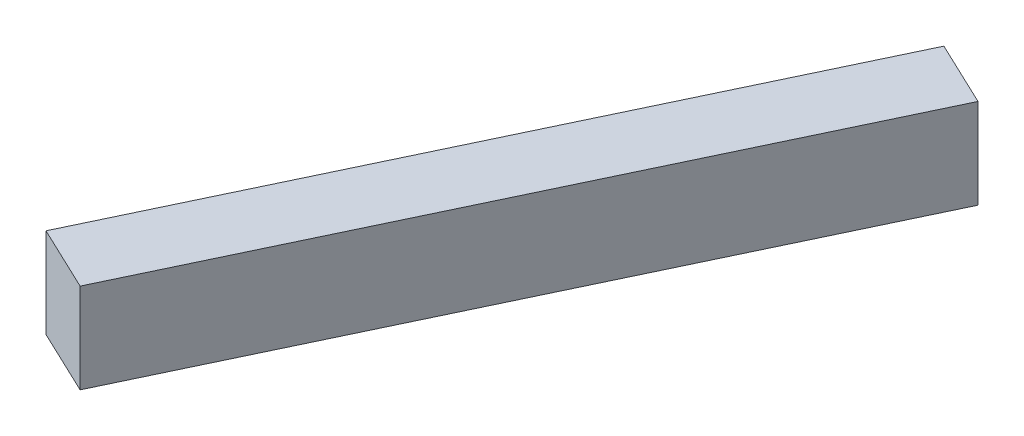
ISO-10303-21;
HEADER;
FILE_DESCRIPTION(('STEP AP214'),'2;1');
FILE_NAME('part.step','',(''),(''),'','','');
FILE_SCHEMA(('AUTOMOTIVE_DESIGN { 1 0 10303 214 1 1 1 1 }'));
ENDSEC;
DATA;
#1=APPLICATION_CONTEXT('core data for automotive mechanical design processes');
#2=APPLICATION_PROTOCOL_DEFINITION('international standard','automotive_design',2000,#1);
#3=PRODUCT_CONTEXT('',#1,'mechanical');
#4=PRODUCT('Part','Part','',(#3));
#5=PRODUCT_RELATED_PRODUCT_CATEGORY('part','',(#4));
#6=PRODUCT_DEFINITION_FORMATION('','',#4);
#7=PRODUCT_DEFINITION_CONTEXT('part definition',#1,'design');
#8=PRODUCT_DEFINITION('design','',#6,#7);
#9=PRODUCT_DEFINITION_SHAPE('','',#8);
#10=(LENGTH_UNIT() NAMED_UNIT(*) SI_UNIT(.MILLI.,.METRE.));
#11=(NAMED_UNIT(*) PLANE_ANGLE_UNIT() SI_UNIT($,.RADIAN.));
#12=(NAMED_UNIT(*) SI_UNIT($,.STERADIAN.) SOLID_ANGLE_UNIT());
#13=UNCERTAINTY_MEASURE_WITH_UNIT(LENGTH_MEASURE(1.E-05),#10,'distance_accuracy_value','');
#14=(GEOMETRIC_REPRESENTATION_CONTEXT(3) GLOBAL_UNCERTAINTY_ASSIGNED_CONTEXT((#13)) GLOBAL_UNIT_ASSIGNED_CONTEXT((#10,
#11,#12)) REPRESENTATION_CONTEXT('',''));
#15=CARTESIAN_POINT('',(0.,0.,0.));
#16=DIRECTION('',(0.,0.,1.));
#17=DIRECTION('',(1.,0.,0.));
#18=AXIS2_PLACEMENT_3D('',#15,#16,#17);
#19=CARTESIAN_POINT('',(7.62701733027126,7.874,-16.3015846991138));
#20=DIRECTION('',(0.903395174700784,0.,0.428808999820829));
#21=DIRECTION('',(0.428808999820829,0.,-0.903395174700784));
#22=AXIS2_PLACEMENT_3D('',#19,#20,#21);
#23=PLANE('',#22);
#24=DIRECTION('',(0.,1.,0.));
#25=VECTOR('',#24,1.);
#26=CARTESIAN_POINT('',(7.62701733027126,7.874,-16.3015846991138));
#27=LINE('',#26,#25);
#28=CARTESIAN_POINT('',(7.62701733027126,7.62,-16.3015846991138));
#29=VERTEX_POINT('',#28);
#30=CARTESIAN_POINT('',(7.62701733027126,7.874,-16.3015846991138));
#31=VERTEX_POINT('',#30);
#32=EDGE_CURVE('E20',#29,#31,#27,.T.);
#33=ORIENTED_EDGE('',*,*,#32,.T.);
#34=DIRECTION('',(0.428808999820828,0.,-0.903395174700785));
#35=VECTOR('',#34,1.);
#36=CARTESIAN_POINT('',(7.62701733027126,7.874,-16.3015846991138));
#37=LINE('',#36,#35);
#38=CARTESIAN_POINT('',(8.44389847492994,7.874,-18.0225525069188));
#39=VERTEX_POINT('',#38);
#40=EDGE_CURVE('E55',#31,#39,#37,.T.);
#41=ORIENTED_EDGE('',*,*,#40,.T.);
#42=DIRECTION('',(0.,1.,0.));
#43=VECTOR('',#42,1.);
#44=CARTESIAN_POINT('',(8.44389847492994,7.874,-18.0225525069188));
#45=LINE('',#44,#43);
#46=CARTESIAN_POINT('',(8.44389847492994,7.62,-18.0225525069188));
#47=VERTEX_POINT('',#46);
#48=EDGE_CURVE('E76',#39,#47,#45,.F.);
#49=ORIENTED_EDGE('',*,*,#48,.T.);
#50=DIRECTION('',(0.428808999820828,0.,-0.903395174700785));
#51=VECTOR('',#50,1.);
#52=CARTESIAN_POINT('',(7.62701733027126,7.62,-16.3015846991138));
#53=LINE('',#52,#51);
#54=EDGE_CURVE('E58',#29,#47,#53,.T.);
#55=ORIENTED_EDGE('',*,*,#54,.F.);
#56=EDGE_LOOP('',(#33,#41,#49,#55));
#57=FACE_BOUND('',#56,.T.);
#58=ADVANCED_FACE('F17',(#57),#23,.F.);
#59=CARTESIAN_POINT('',(7.62701733027126,7.874,-16.3015846991138));
#60=DIRECTION('',(0.428808999821659,0.,-0.90339517470039));
#61=DIRECTION('',(-0.90339517470039,0.,-0.428808999821659));
#62=AXIS2_PLACEMENT_3D('',#59,#60,#61);
#63=PLANE('',#62);
#64=DIRECTION('',(0.,1.,0.));
#65=VECTOR('',#64,1.);
#66=CARTESIAN_POINT('',(7.81058722977098,7.874,-16.2144507103497));
#67=LINE('',#66,#65);
#68=CARTESIAN_POINT('',(7.81058722977099,7.62,-16.2144507103497));
#69=VERTEX_POINT('',#68);
#70=CARTESIAN_POINT('',(7.81058722977099,7.874,-16.2144507103497));
#71=VERTEX_POINT('',#70);
#72=EDGE_CURVE('E73',#69,#71,#67,.T.);
#73=ORIENTED_EDGE('',*,*,#72,.T.);
#74=DIRECTION('',(-0.903395174700285,0.,-0.428808999821881));
#75=VECTOR('',#74,1.);
#76=CARTESIAN_POINT('',(7.81058722977098,7.874,-16.2144507103497));
#77=LINE('',#76,#75);
#78=EDGE_CURVE('E63',#71,#31,#77,.T.);
#79=ORIENTED_EDGE('',*,*,#78,.T.);
#80=ORIENTED_EDGE('',*,*,#32,.F.);
#81=DIRECTION('',(-0.903395174700285,0.,-0.428808999821881));
#82=VECTOR('',#81,1.);
#83=CARTESIAN_POINT('',(7.81058722977098,7.62,-16.2144507103497));
#84=LINE('',#83,#82);
#85=EDGE_CURVE('E80',#69,#29,#84,.T.);
#86=ORIENTED_EDGE('',*,*,#85,.F.);
#87=EDGE_LOOP('',(#73,#79,#80,#86));
#88=FACE_BOUND('',#87,.T.);
#89=ADVANCED_FACE('F72',(#88),#63,.F.);
#90=CARTESIAN_POINT('',(7.62701733027126,7.874,-16.3015846991138));
#91=DIRECTION('',(0.,-1.,0.));
#92=DIRECTION('',(0.,0.,-1.));
#93=AXIS2_PLACEMENT_3D('',#90,#91,#92);
#94=PLANE('',#93);
#95=ORIENTED_EDGE('',*,*,#78,.F.);
#96=DIRECTION('',(-0.428808999820516,0.,0.903395174700933));
#97=VECTOR('',#96,1.);
#98=CARTESIAN_POINT('',(7.81058722977098,7.874,-16.2144507103497));
#99=LINE('',#98,#97);
#100=CARTESIAN_POINT('',(8.62746837456179,7.874,-17.9354185184346));
#101=VERTEX_POINT('',#100);
#102=EDGE_CURVE('E83',#71,#101,#99,.F.);
#103=ORIENTED_EDGE('',*,*,#102,.T.);
#104=DIRECTION('',(0.903395175353546,0.,0.42880899844562));
#105=VECTOR('',#104,1.);
#106=CARTESIAN_POINT('',(8.44389847492994,7.874,-18.0225525069188));
#107=LINE('',#106,#105);
#108=EDGE_CURVE('E69',#101,#39,#107,.F.);
#109=ORIENTED_EDGE('',*,*,#108,.T.);
#110=ORIENTED_EDGE('',*,*,#40,.F.);
#111=EDGE_LOOP('',(#95,#103,#109,#110));
#112=FACE_BOUND('',#111,.T.);
#113=ADVANCED_FACE('F66',(#112),#94,.F.);
#114=CARTESIAN_POINT('',(8.44389847492994,7.874,-18.0225525069188));
#115=DIRECTION('',(-0.42880899844562,0.,0.903395175353546));
#116=DIRECTION('',(0.903395175353546,0.,0.42880899844562));
#117=AXIS2_PLACEMENT_3D('',#114,#115,#116);
#118=PLANE('',#117);
#119=ORIENTED_EDGE('',*,*,#48,.F.);
#120=ORIENTED_EDGE('',*,*,#108,.F.);
#121=DIRECTION('',(0.,1.,0.));
#122=VECTOR('',#121,1.);
#123=CARTESIAN_POINT('',(8.62746837456179,7.874,-17.9354185184346));
#124=LINE('',#123,#122);
#125=CARTESIAN_POINT('',(8.6274683745618,7.62,-17.9354185184346));
#126=VERTEX_POINT('',#125);
#127=EDGE_CURVE('E26',#101,#126,#124,.F.);
#128=ORIENTED_EDGE('',*,*,#127,.T.);
#129=DIRECTION('',(0.90339517535346,0.,0.428808998445802));
#130=VECTOR('',#129,1.);
#131=CARTESIAN_POINT('',(8.44389847492994,7.62,-18.0225525069188));
#132=LINE('',#131,#130);
#133=EDGE_CURVE('E34',#47,#126,#132,.T.);
#134=ORIENTED_EDGE('',*,*,#133,.F.);
#135=EDGE_LOOP('',(#119,#120,#128,#134));
#136=FACE_BOUND('',#135,.T.);
#137=ADVANCED_FACE('F88',(#136),#118,.F.);
#138=CARTESIAN_POINT('',(7.62701733027126,7.62,-16.3015846991138));
#139=DIRECTION('',(0.,-1.,0.));
#140=DIRECTION('',(0.,0.,-1.));
#141=AXIS2_PLACEMENT_3D('',#138,#139,#140);
#142=PLANE('',#141);
#143=DIRECTION('',(-0.428808999820516,0.,0.903395174700933));
#144=VECTOR('',#143,1.);
#145=CARTESIAN_POINT('',(7.81058722977098,7.62,-16.2144507103497));
#146=LINE('',#145,#144);
#147=EDGE_CURVE('E11',#126,#69,#146,.T.);
#148=ORIENTED_EDGE('',*,*,#147,.T.);
#149=ORIENTED_EDGE('',*,*,#85,.T.);
#150=ORIENTED_EDGE('',*,*,#54,.T.);
#151=ORIENTED_EDGE('',*,*,#133,.T.);
#152=EDGE_LOOP('',(#148,#149,#150,#151));
#153=FACE_BOUND('',#152,.T.);
#154=ADVANCED_FACE('F91',(#153),#142,.T.);
#155=CARTESIAN_POINT('',(7.81058722977098,7.874,-16.2144507103497));
#156=DIRECTION('',(-0.903395174700933,0.,-0.428808999820516));
#157=DIRECTION('',(-0.428808999820516,0.,0.903395174700933));
#158=AXIS2_PLACEMENT_3D('',#155,#156,#157);
#159=PLANE('',#158);
#160=ORIENTED_EDGE('',*,*,#127,.F.);
#161=ORIENTED_EDGE('',*,*,#102,.F.);
#162=ORIENTED_EDGE('',*,*,#72,.F.);
#163=ORIENTED_EDGE('',*,*,#147,.F.);
#164=EDGE_LOOP('',(#160,#161,#162,#163));
#165=FACE_BOUND('',#164,.T.);
#166=ADVANCED_FACE('F90',(#165),#159,.F.);
#167=CLOSED_SHELL('',(#58,#89,#113,#137,#154,#166));
#168=MANIFOLD_SOLID_BREP('B1',#167);
#169=ADVANCED_BREP_SHAPE_REPRESENTATION('',(#18,#168),#14);
#170=SHAPE_DEFINITION_REPRESENTATION(#9,#169);
ENDSEC;
END-ISO-10303-21;
